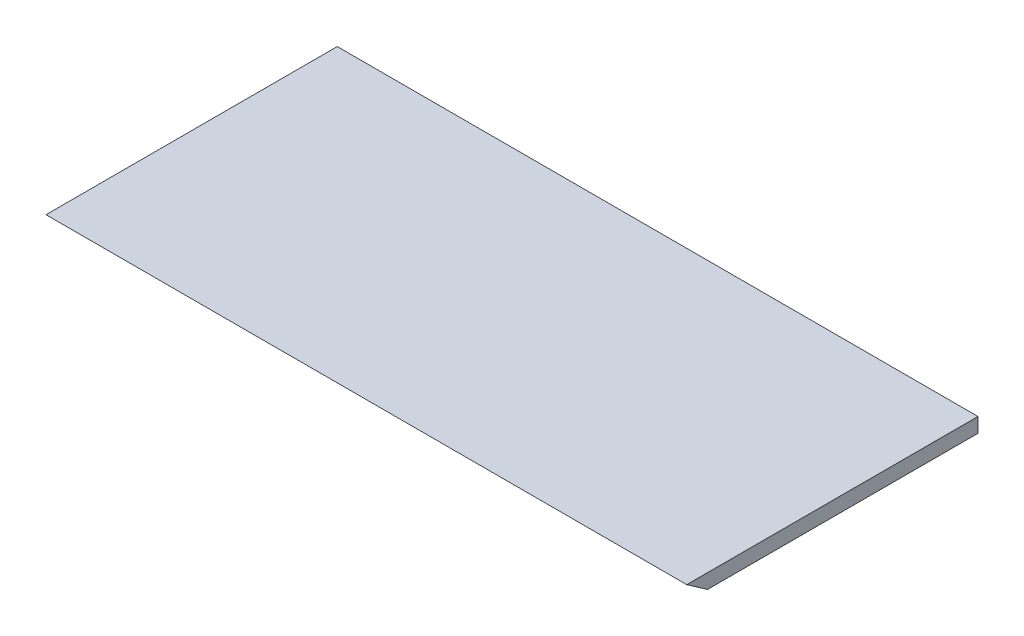
ISO-10303-21;
HEADER;
FILE_DESCRIPTION(('STEP AP214'),'2;1');
FILE_NAME('part.step','',(''),(''),'','','');
FILE_SCHEMA(('AUTOMOTIVE_DESIGN { 1 0 10303 214 1 1 1 1 }'));
ENDSEC;
DATA;
#1=APPLICATION_CONTEXT('core data for automotive mechanical design processes');
#2=APPLICATION_PROTOCOL_DEFINITION('international standard','automotive_design',2000,#1);
#3=PRODUCT_CONTEXT('',#1,'mechanical');
#4=PRODUCT('Part','Part','',(#3));
#5=PRODUCT_RELATED_PRODUCT_CATEGORY('part','',(#4));
#6=PRODUCT_DEFINITION_FORMATION('','',#4);
#7=PRODUCT_DEFINITION_CONTEXT('part definition',#1,'design');
#8=PRODUCT_DEFINITION('design','',#6,#7);
#9=PRODUCT_DEFINITION_SHAPE('','',#8);
#10=(LENGTH_UNIT() NAMED_UNIT(*) SI_UNIT(.MILLI.,.METRE.));
#11=(NAMED_UNIT(*) PLANE_ANGLE_UNIT() SI_UNIT($,.RADIAN.));
#12=(NAMED_UNIT(*) SI_UNIT($,.STERADIAN.) SOLID_ANGLE_UNIT());
#13=UNCERTAINTY_MEASURE_WITH_UNIT(LENGTH_MEASURE(1.E-05),#10,'distance_accuracy_value','');
#14=(GEOMETRIC_REPRESENTATION_CONTEXT(3) GLOBAL_UNCERTAINTY_ASSIGNED_CONTEXT((#13)) GLOBAL_UNIT_ASSIGNED_CONTEXT((#10,
#11,#12)) REPRESENTATION_CONTEXT('',''));
#15=CARTESIAN_POINT('',(0.,0.,0.));
#16=DIRECTION('',(0.,0.,1.));
#17=DIRECTION('',(1.,0.,0.));
#18=AXIS2_PLACEMENT_3D('',#15,#16,#17);
#19=CARTESIAN_POINT('',(-69.85,3.175,31.75));
#20=DIRECTION('',(1.,0.,0.));
#21=DIRECTION('',(0.,0.,-1.));
#22=AXIS2_PLACEMENT_3D('',#19,#20,#21);
#23=PLANE('',#22);
#24=DIRECTION('',(0.,0.,1.));
#25=VECTOR('',#24,1.);
#26=CARTESIAN_POINT('',(-69.85,0.,31.75));
#27=LINE('',#26,#25);
#28=CARTESIAN_POINT('',(-69.85,0.,-31.75));
#29=VERTEX_POINT('',#28);
#30=CARTESIAN_POINT('',(-69.85,0.,27.2156300785939));
#31=VERTEX_POINT('',#30);
#32=EDGE_CURVE('E83',#29,#31,#27,.T.);
#33=ORIENTED_EDGE('',*,*,#32,.T.);
#34=DIRECTION('',(0.,-0.573576436351051,-0.819152044288989));
#35=VECTOR('',#34,1.);
#36=CARTESIAN_POINT('',(-69.85,3.17499999999999,31.75));
#37=LINE('',#36,#35);
#38=CARTESIAN_POINT('',(-69.85,3.175,31.75));
#39=VERTEX_POINT('',#38);
#40=EDGE_CURVE('E11',#31,#39,#37,.F.);
#41=ORIENTED_EDGE('',*,*,#40,.T.);
#42=DIRECTION('',(0.,0.,1.));
#43=VECTOR('',#42,1.);
#44=CARTESIAN_POINT('',(-69.85,3.175,31.75));
#45=LINE('',#44,#43);
#46=CARTESIAN_POINT('',(-69.85,3.175,-31.75));
#47=VERTEX_POINT('',#46);
#48=EDGE_CURVE('E82',#47,#39,#45,.T.);
#49=ORIENTED_EDGE('',*,*,#48,.F.);
#50=DIRECTION('',(0.,-1.,0.));
#51=VECTOR('',#50,1.);
#52=CARTESIAN_POINT('',(-69.85,3.175,-31.75));
#53=LINE('',#52,#51);
#54=EDGE_CURVE('E104',#47,#29,#53,.T.);
#55=ORIENTED_EDGE('',*,*,#54,.T.);
#56=EDGE_LOOP('',(#33,#41,#49,#55));
#57=FACE_BOUND('',#56,.T.);
#58=ADVANCED_FACE('F39',(#57),#23,.F.);
#59=CARTESIAN_POINT('',(69.85,3.175,31.75));
#60=DIRECTION('',(-1.,0.,0.));
#61=DIRECTION('',(0.,0.,1.));
#62=AXIS2_PLACEMENT_3D('',#59,#60,#61);
#63=PLANE('',#62);
#64=DIRECTION('',(0.,0.,-1.));
#65=VECTOR('',#64,1.);
#66=CARTESIAN_POINT('',(69.85,3.175,31.75));
#67=LINE('',#66,#65);
#68=CARTESIAN_POINT('',(69.85,3.175,31.75));
#69=VERTEX_POINT('',#68);
#70=CARTESIAN_POINT('',(69.85,3.175,-31.75));
#71=VERTEX_POINT('',#70);
#72=EDGE_CURVE('E97',#69,#71,#67,.T.);
#73=ORIENTED_EDGE('',*,*,#72,.F.);
#74=DIRECTION('',(0.,0.573576436351051,0.819152044288989));
#75=VECTOR('',#74,1.);
#76=CARTESIAN_POINT('',(69.85,3.175,31.75));
#77=LINE('',#76,#75);
#78=CARTESIAN_POINT('',(69.85,0.,27.2156300785938));
#79=VERTEX_POINT('',#78);
#80=EDGE_CURVE('E62',#69,#79,#77,.F.);
#81=ORIENTED_EDGE('',*,*,#80,.T.);
#82=DIRECTION('',(0.,0.,-1.));
#83=VECTOR('',#82,1.);
#84=CARTESIAN_POINT('',(69.85,0.,31.75));
#85=LINE('',#84,#83);
#86=CARTESIAN_POINT('',(69.85,0.,-31.75));
#87=VERTEX_POINT('',#86);
#88=EDGE_CURVE('E107',#79,#87,#85,.T.);
#89=ORIENTED_EDGE('',*,*,#88,.T.);
#90=DIRECTION('',(0.,-1.,0.));
#91=VECTOR('',#90,1.);
#92=CARTESIAN_POINT('',(69.85,3.175,-31.75));
#93=LINE('',#92,#91);
#94=EDGE_CURVE('E114',#71,#87,#93,.T.);
#95=ORIENTED_EDGE('',*,*,#94,.F.);
#96=EDGE_LOOP('',(#73,#81,#89,#95));
#97=FACE_BOUND('',#96,.T.);
#98=ADVANCED_FACE('F125',(#97),#63,.F.);
#99=CARTESIAN_POINT('',(69.85,3.175,-31.75));
#100=DIRECTION('',(0.,0.,1.));
#101=DIRECTION('',(1.,0.,0.));
#102=AXIS2_PLACEMENT_3D('',#99,#100,#101);
#103=PLANE('',#102);
#104=DIRECTION('',(-1.,0.,0.));
#105=VECTOR('',#104,1.);
#106=CARTESIAN_POINT('',(69.85,0.,-31.75));
#107=LINE('',#106,#105);
#108=EDGE_CURVE('E94',#87,#29,#107,.T.);
#109=ORIENTED_EDGE('',*,*,#108,.T.);
#110=ORIENTED_EDGE('',*,*,#54,.F.);
#111=DIRECTION('',(-1.,0.,0.));
#112=VECTOR('',#111,1.);
#113=CARTESIAN_POINT('',(69.85,3.175,-31.75));
#114=LINE('',#113,#112);
#115=EDGE_CURVE('E91',#71,#47,#114,.T.);
#116=ORIENTED_EDGE('',*,*,#115,.F.);
#117=ORIENTED_EDGE('',*,*,#94,.T.);
#118=EDGE_LOOP('',(#109,#110,#116,#117));
#119=FACE_BOUND('',#118,.T.);
#120=ADVANCED_FACE('F123',(#119),#103,.F.);
#121=CARTESIAN_POINT('',(0.,3.175,0.));
#122=DIRECTION('',(0.,1.,0.));
#123=DIRECTION('',(0.,0.,1.));
#124=AXIS2_PLACEMENT_3D('',#121,#122,#123);
#125=PLANE('',#124);
#126=ORIENTED_EDGE('',*,*,#48,.T.);
#127=DIRECTION('',(1.,0.,0.));
#128=VECTOR('',#127,1.);
#129=CARTESIAN_POINT('',(69.85,3.175,31.75));
#130=LINE('',#129,#128);
#131=EDGE_CURVE('E89',#39,#69,#130,.T.);
#132=ORIENTED_EDGE('',*,*,#131,.T.);
#133=ORIENTED_EDGE('',*,*,#72,.T.);
#134=ORIENTED_EDGE('',*,*,#115,.T.);
#135=EDGE_LOOP('',(#126,#132,#133,#134));
#136=FACE_BOUND('',#135,.T.);
#137=ADVANCED_FACE('F88',(#136),#125,.T.);
#138=CARTESIAN_POINT('',(0.,0.,0.));
#139=DIRECTION('',(0.,1.,0.));
#140=DIRECTION('',(0.,0.,1.));
#141=AXIS2_PLACEMENT_3D('',#138,#139,#140);
#142=PLANE('',#141);
#143=ORIENTED_EDGE('',*,*,#88,.F.);
#144=DIRECTION('',(-1.,0.,0.));
#145=VECTOR('',#144,1.);
#146=CARTESIAN_POINT('',(0.,0.,27.2156300785939));
#147=LINE('',#146,#145);
#148=EDGE_CURVE('E48',#79,#31,#147,.T.);
#149=ORIENTED_EDGE('',*,*,#148,.T.);
#150=ORIENTED_EDGE('',*,*,#32,.F.);
#151=ORIENTED_EDGE('',*,*,#108,.F.);
#152=EDGE_LOOP('',(#143,#149,#150,#151));
#153=FACE_BOUND('',#152,.T.);
#154=ADVANCED_FACE('F124',(#153),#142,.F.);
#155=CARTESIAN_POINT('',(69.85,3.175,31.75));
#156=DIRECTION('',(0.,0.819152044288989,-0.573576436351051));
#157=DIRECTION('',(1.,0.,0.));
#158=AXIS2_PLACEMENT_3D('',#155,#156,#157);
#159=PLANE('',#158);
#160=ORIENTED_EDGE('',*,*,#40,.F.);
#161=ORIENTED_EDGE('',*,*,#148,.F.);
#162=ORIENTED_EDGE('',*,*,#80,.F.);
#163=ORIENTED_EDGE('',*,*,#131,.F.);
#164=EDGE_LOOP('',(#160,#161,#162,#163));
#165=FACE_BOUND('',#164,.T.);
#166=ADVANCED_FACE('F41',(#165),#159,.F.);
#167=CLOSED_SHELL('',(#58,#98,#120,#137,#154,#166));
#168=MANIFOLD_SOLID_BREP('B2',#167);
#169=ADVANCED_BREP_SHAPE_REPRESENTATION('',(#18,#168),#14);
#170=SHAPE_DEFINITION_REPRESENTATION(#9,#169);
ENDSEC;
END-ISO-10303-21;
